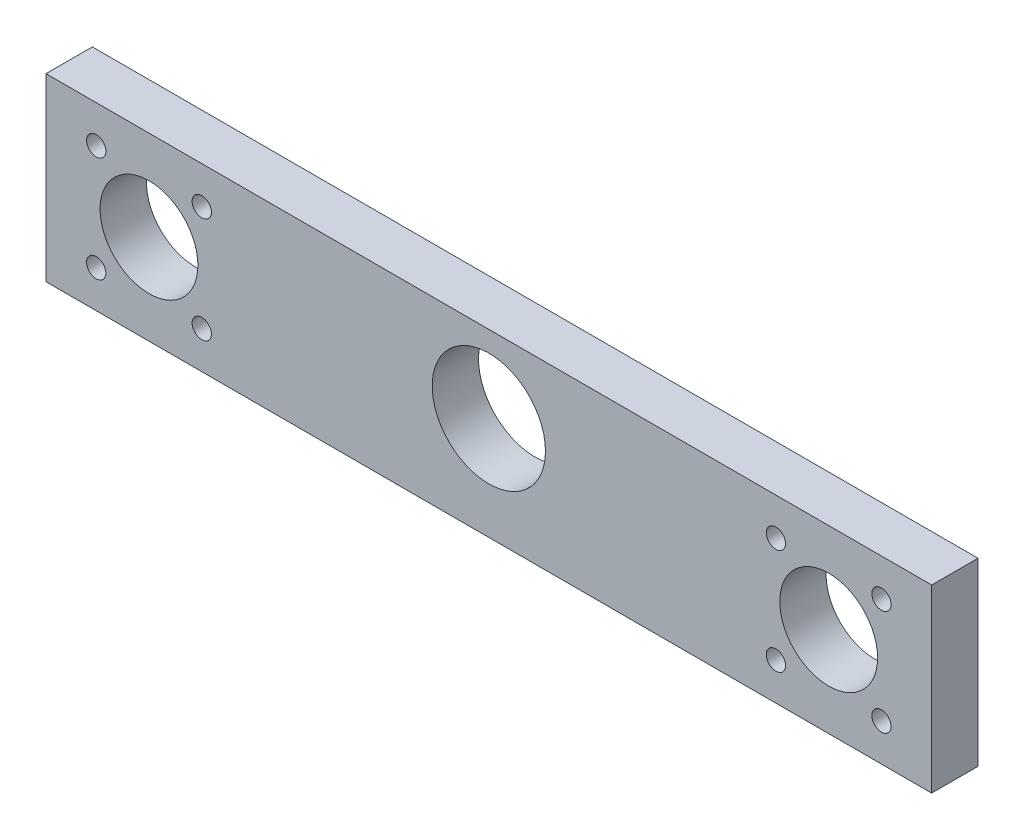
ISO-10303-21;
HEADER;
FILE_DESCRIPTION(('STEP AP214'),'2;1');
FILE_NAME('part.step','',(''),(''),'','','');
FILE_SCHEMA(('AUTOMOTIVE_DESIGN { 1 0 10303 214 1 1 1 1 }'));
ENDSEC;
DATA;
#1=APPLICATION_CONTEXT('core data for automotive mechanical design processes');
#2=APPLICATION_PROTOCOL_DEFINITION('international standard','automotive_design',2000,#1);
#3=PRODUCT_CONTEXT('',#1,'mechanical');
#4=PRODUCT('Part','Part','',(#3));
#5=PRODUCT_RELATED_PRODUCT_CATEGORY('part','',(#4));
#6=PRODUCT_DEFINITION_FORMATION('','',#4);
#7=PRODUCT_DEFINITION_CONTEXT('part definition',#1,'design');
#8=PRODUCT_DEFINITION('design','',#6,#7);
#9=PRODUCT_DEFINITION_SHAPE('','',#8);
#10=(LENGTH_UNIT() NAMED_UNIT(*) SI_UNIT(.MILLI.,.METRE.));
#11=(NAMED_UNIT(*) PLANE_ANGLE_UNIT() SI_UNIT($,.RADIAN.));
#12=(NAMED_UNIT(*) SI_UNIT($,.STERADIAN.) SOLID_ANGLE_UNIT());
#13=UNCERTAINTY_MEASURE_WITH_UNIT(LENGTH_MEASURE(1.E-05),#10,'distance_accuracy_value','');
#14=(GEOMETRIC_REPRESENTATION_CONTEXT(3) GLOBAL_UNCERTAINTY_ASSIGNED_CONTEXT((#13)) GLOBAL_UNIT_ASSIGNED_CONTEXT((#10,
#11,#12)) REPRESENTATION_CONTEXT('',''));
#15=CARTESIAN_POINT('',(0.,0.,0.));
#16=DIRECTION('',(0.,0.,1.));
#17=DIRECTION('',(1.,0.,0.));
#18=AXIS2_PLACEMENT_3D('',#15,#16,#17);
#19=CARTESIAN_POINT('',(0.,0.,9.));
#20=DIRECTION('',(1.,0.,0.));
#21=DIRECTION('',(0.,0.,-1.));
#22=AXIS2_PLACEMENT_3D('',#19,#20,#21);
#23=PLANE('',#22);
#24=DIRECTION('',(0.,-1.,0.));
#25=VECTOR('',#24,1.);
#26=CARTESIAN_POINT('',(0.,0.,0.));
#27=LINE('',#26,#25);
#28=CARTESIAN_POINT('',(0.,35.,0.));
#29=VERTEX_POINT('',#28);
#30=CARTESIAN_POINT('',(0.,0.,0.));
#31=VERTEX_POINT('',#30);
#32=EDGE_CURVE('E111',#29,#31,#27,.T.);
#33=ORIENTED_EDGE('',*,*,#32,.T.);
#34=DIRECTION('',(0.,0.,-1.));
#35=VECTOR('',#34,1.);
#36=CARTESIAN_POINT('',(0.,0.,9.));
#37=LINE('',#36,#35);
#38=CARTESIAN_POINT('',(0.,0.,9.));
#39=VERTEX_POINT('',#38);
#40=EDGE_CURVE('E11',#39,#31,#37,.T.);
#41=ORIENTED_EDGE('',*,*,#40,.F.);
#42=DIRECTION('',(0.,-1.,0.));
#43=VECTOR('',#42,1.);
#44=CARTESIAN_POINT('',(0.,0.,9.));
#45=LINE('',#44,#43);
#46=CARTESIAN_POINT('',(0.,35.,9.));
#47=VERTEX_POINT('',#46);
#48=EDGE_CURVE('E95',#47,#39,#45,.T.);
#49=ORIENTED_EDGE('',*,*,#48,.F.);
#50=DIRECTION('',(0.,0.,-1.));
#51=VECTOR('',#50,1.);
#52=CARTESIAN_POINT('',(0.,35.,9.));
#53=LINE('',#52,#51);
#54=EDGE_CURVE('E107',#47,#29,#53,.T.);
#55=ORIENTED_EDGE('',*,*,#54,.T.);
#56=EDGE_LOOP('',(#33,#41,#49,#55));
#57=FACE_BOUND('',#56,.T.);
#58=ADVANCED_FACE('F43',(#57),#23,.F.);
#59=CARTESIAN_POINT('',(0.,0.,9.));
#60=DIRECTION('',(0.,1.,0.));
#61=DIRECTION('',(0.,0.,1.));
#62=AXIS2_PLACEMENT_3D('',#59,#60,#61);
#63=PLANE('',#62);
#64=DIRECTION('',(1.,0.,0.));
#65=VECTOR('',#64,1.);
#66=CARTESIAN_POINT('',(0.,0.,0.));
#67=LINE('',#66,#65);
#68=CARTESIAN_POINT('',(172.,0.,0.));
#69=VERTEX_POINT('',#68);
#70=EDGE_CURVE('E100',#31,#69,#67,.T.);
#71=ORIENTED_EDGE('',*,*,#70,.T.);
#72=DIRECTION('',(0.,0.,-1.));
#73=VECTOR('',#72,1.);
#74=CARTESIAN_POINT('',(172.,0.,9.));
#75=LINE('',#74,#73);
#76=CARTESIAN_POINT('',(172.,0.,9.));
#77=VERTEX_POINT('',#76);
#78=EDGE_CURVE('E52',#77,#69,#75,.T.);
#79=ORIENTED_EDGE('',*,*,#78,.F.);
#80=DIRECTION('',(1.,0.,0.));
#81=VECTOR('',#80,1.);
#82=CARTESIAN_POINT('',(0.,0.,9.));
#83=LINE('',#82,#81);
#84=EDGE_CURVE('E90',#39,#77,#83,.T.);
#85=ORIENTED_EDGE('',*,*,#84,.F.);
#86=ORIENTED_EDGE('',*,*,#40,.T.);
#87=EDGE_LOOP('',(#71,#79,#85,#86));
#88=FACE_BOUND('',#87,.T.);
#89=ADVANCED_FACE('F99',(#88),#63,.F.);
#90=CARTESIAN_POINT('',(172.,0.,9.));
#91=DIRECTION('',(-1.,0.,0.));
#92=DIRECTION('',(0.,0.,1.));
#93=AXIS2_PLACEMENT_3D('',#90,#91,#92);
#94=PLANE('',#93);
#95=DIRECTION('',(0.,1.,0.));
#96=VECTOR('',#95,1.);
#97=CARTESIAN_POINT('',(172.,0.,0.));
#98=LINE('',#97,#96);
#99=CARTESIAN_POINT('',(172.,35.,0.));
#100=VERTEX_POINT('',#99);
#101=EDGE_CURVE('E77',#69,#100,#98,.T.);
#102=ORIENTED_EDGE('',*,*,#101,.T.);
#103=DIRECTION('',(0.,0.,-1.));
#104=VECTOR('',#103,1.);
#105=CARTESIAN_POINT('',(172.,35.,9.));
#106=LINE('',#105,#104);
#107=CARTESIAN_POINT('',(172.,35.,9.));
#108=VERTEX_POINT('',#107);
#109=EDGE_CURVE('E102',#108,#100,#106,.T.);
#110=ORIENTED_EDGE('',*,*,#109,.F.);
#111=DIRECTION('',(0.,1.,0.));
#112=VECTOR('',#111,1.);
#113=CARTESIAN_POINT('',(172.,0.,9.));
#114=LINE('',#113,#112);
#115=EDGE_CURVE('E93',#77,#108,#114,.T.);
#116=ORIENTED_EDGE('',*,*,#115,.F.);
#117=ORIENTED_EDGE('',*,*,#78,.T.);
#118=EDGE_LOOP('',(#102,#110,#116,#117));
#119=FACE_BOUND('',#118,.T.);
#120=ADVANCED_FACE('F103',(#119),#94,.F.);
#121=CARTESIAN_POINT('',(0.,35.,9.));
#122=DIRECTION('',(0.,-1.,0.));
#123=DIRECTION('',(0.,0.,-1.));
#124=AXIS2_PLACEMENT_3D('',#121,#122,#123);
#125=PLANE('',#124);
#126=DIRECTION('',(-1.,0.,0.));
#127=VECTOR('',#126,1.);
#128=CARTESIAN_POINT('',(0.,35.,0.));
#129=LINE('',#128,#127);
#130=EDGE_CURVE('E83',#100,#29,#129,.T.);
#131=ORIENTED_EDGE('',*,*,#130,.T.);
#132=ORIENTED_EDGE('',*,*,#54,.F.);
#133=DIRECTION('',(-1.,0.,0.));
#134=VECTOR('',#133,1.);
#135=CARTESIAN_POINT('',(0.,35.,9.));
#136=LINE('',#135,#134);
#137=EDGE_CURVE('E60',#108,#47,#136,.T.);
#138=ORIENTED_EDGE('',*,*,#137,.F.);
#139=ORIENTED_EDGE('',*,*,#109,.T.);
#140=EDGE_LOOP('',(#131,#132,#138,#139));
#141=FACE_BOUND('',#140,.T.);
#142=ADVANCED_FACE('F125',(#141),#125,.F.);
#143=CARTESIAN_POINT('',(0.,0.,9.));
#144=DIRECTION('',(0.,0.,-1.));
#145=DIRECTION('',(-1.,0.,0.));
#146=AXIS2_PLACEMENT_3D('',#143,#144,#145);
#147=PLANE('',#146);
#148=CARTESIAN_POINT('',(162.25,27.75,9.));
#149=DIRECTION('',(0.,0.,1.));
#150=DIRECTION('',(1.,0.,0.));
#151=AXIS2_PLACEMENT_3D('',#148,#149,#150);
#152=CIRCLE('',#151,1.87499999999999);
#153=CARTESIAN_POINT('',(164.125,27.75,9.));
#154=VERTEX_POINT('',#153);
#155=EDGE_CURVE('E161',#154,#154,#152,.T.);
#156=ORIENTED_EDGE('',*,*,#155,.F.);
#157=EDGE_LOOP('',(#156));
#158=FACE_BOUND('',#157,.T.);
#159=CARTESIAN_POINT('',(141.75,7.25,9.));
#160=DIRECTION('',(0.,0.,1.));
#161=DIRECTION('',(1.,0.,0.));
#162=AXIS2_PLACEMENT_3D('',#159,#160,#161);
#163=CIRCLE('',#162,1.87499999999999);
#164=CARTESIAN_POINT('',(143.625,7.25,9.));
#165=VERTEX_POINT('',#164);
#166=EDGE_CURVE('E176',#165,#165,#163,.T.);
#167=ORIENTED_EDGE('',*,*,#166,.F.);
#168=EDGE_LOOP('',(#167));
#169=FACE_BOUND('',#168,.T.);
#170=CARTESIAN_POINT('',(152.,17.5,9.));
#171=DIRECTION('',(0.,0.,1.));
#172=DIRECTION('',(1.,0.,0.));
#173=AXIS2_PLACEMENT_3D('',#170,#171,#172);
#174=CIRCLE('',#173,9.50000000000001);
#175=CARTESIAN_POINT('',(161.5,17.5,9.));
#176=VERTEX_POINT('',#175);
#177=EDGE_CURVE('E192',#176,#176,#174,.T.);
#178=ORIENTED_EDGE('',*,*,#177,.F.);
#179=EDGE_LOOP('',(#178));
#180=FACE_BOUND('',#179,.T.);
#181=CARTESIAN_POINT('',(162.25,7.25,9.));
#182=DIRECTION('',(0.,0.,1.));
#183=DIRECTION('',(1.,0.,0.));
#184=AXIS2_PLACEMENT_3D('',#181,#182,#183);
#185=CIRCLE('',#184,1.87499999999999);
#186=CARTESIAN_POINT('',(164.125,7.25,9.));
#187=VERTEX_POINT('',#186);
#188=EDGE_CURVE('E177',#187,#187,#185,.T.);
#189=ORIENTED_EDGE('',*,*,#188,.F.);
#190=EDGE_LOOP('',(#189));
#191=FACE_BOUND('',#190,.T.);
#192=CARTESIAN_POINT('',(30.25,27.75,9.));
#193=DIRECTION('',(0.,0.,1.));
#194=DIRECTION('',(1.,0.,0.));
#195=AXIS2_PLACEMENT_3D('',#192,#193,#194);
#196=CIRCLE('',#195,1.875);
#197=CARTESIAN_POINT('',(32.125,27.75,9.));
#198=VERTEX_POINT('',#197);
#199=EDGE_CURVE('E136',#198,#198,#196,.T.);
#200=ORIENTED_EDGE('',*,*,#199,.F.);
#201=EDGE_LOOP('',(#200));
#202=FACE_BOUND('',#201,.T.);
#203=CARTESIAN_POINT('',(9.75000000000001,7.25,9.));
#204=DIRECTION('',(0.,0.,1.));
#205=DIRECTION('',(1.,0.,0.));
#206=AXIS2_PLACEMENT_3D('',#203,#204,#205);
#207=CIRCLE('',#206,1.875);
#208=CARTESIAN_POINT('',(11.625,7.25,9.));
#209=VERTEX_POINT('',#208);
#210=EDGE_CURVE('E144',#209,#209,#207,.T.);
#211=ORIENTED_EDGE('',*,*,#210,.F.);
#212=EDGE_LOOP('',(#211));
#213=FACE_BOUND('',#212,.T.);
#214=CARTESIAN_POINT('',(30.25,7.25,9.));
#215=DIRECTION('',(0.,0.,1.));
#216=DIRECTION('',(1.,0.,0.));
#217=AXIS2_PLACEMENT_3D('',#214,#215,#216);
#218=CIRCLE('',#217,1.875);
#219=CARTESIAN_POINT('',(32.125,7.25,9.));
#220=VERTEX_POINT('',#219);
#221=EDGE_CURVE('E145',#220,#220,#218,.T.);
#222=ORIENTED_EDGE('',*,*,#221,.F.);
#223=EDGE_LOOP('',(#222));
#224=FACE_BOUND('',#223,.T.);
#225=CARTESIAN_POINT('',(141.75,27.75,9.));
#226=DIRECTION('',(0.,0.,1.));
#227=DIRECTION('',(1.,0.,0.));
#228=AXIS2_PLACEMENT_3D('',#225,#226,#227);
#229=CIRCLE('',#228,1.87499999999999);
#230=CARTESIAN_POINT('',(143.625,27.75,9.));
#231=VERTEX_POINT('',#230);
#232=EDGE_CURVE('E160',#231,#231,#229,.T.);
#233=ORIENTED_EDGE('',*,*,#232,.F.);
#234=EDGE_LOOP('',(#233));
#235=FACE_BOUND('',#234,.T.);
#236=CARTESIAN_POINT('',(20.,17.5,9.));
#237=DIRECTION('',(0.,0.,1.));
#238=DIRECTION('',(1.,0.,0.));
#239=AXIS2_PLACEMENT_3D('',#236,#237,#238);
#240=CIRCLE('',#239,9.5);
#241=CARTESIAN_POINT('',(29.5,17.5,9.));
#242=VERTEX_POINT('',#241);
#243=EDGE_CURVE('E200',#242,#242,#240,.T.);
#244=ORIENTED_EDGE('',*,*,#243,.F.);
#245=EDGE_LOOP('',(#244));
#246=FACE_BOUND('',#245,.T.);
#247=CARTESIAN_POINT('',(86.,20.,9.));
#248=DIRECTION('',(0.,0.,1.));
#249=DIRECTION('',(1.,0.,0.));
#250=AXIS2_PLACEMENT_3D('',#247,#248,#249);
#251=CIRCLE('',#250,11.);
#252=CARTESIAN_POINT('',(97.,20.,9.));
#253=VERTEX_POINT('',#252);
#254=EDGE_CURVE('E208',#253,#253,#251,.T.);
#255=ORIENTED_EDGE('',*,*,#254,.F.);
#256=EDGE_LOOP('',(#255));
#257=FACE_BOUND('',#256,.T.);
#258=CARTESIAN_POINT('',(9.75000000000001,27.75,9.));
#259=DIRECTION('',(0.,0.,1.));
#260=DIRECTION('',(1.,0.,0.));
#261=AXIS2_PLACEMENT_3D('',#258,#259,#260);
#262=CIRCLE('',#261,1.875);
#263=CARTESIAN_POINT('',(11.625,27.75,9.));
#264=VERTEX_POINT('',#263);
#265=EDGE_CURVE('E132',#264,#264,#262,.T.);
#266=ORIENTED_EDGE('',*,*,#265,.F.);
#267=EDGE_LOOP('',(#266));
#268=FACE_BOUND('',#267,.T.);
#269=ORIENTED_EDGE('',*,*,#48,.T.);
#270=ORIENTED_EDGE('',*,*,#84,.T.);
#271=ORIENTED_EDGE('',*,*,#115,.T.);
#272=ORIENTED_EDGE('',*,*,#137,.T.);
#273=EDGE_LOOP('',(#269,#270,#271,#272));
#274=FACE_BOUND('',#273,.T.);
#275=ADVANCED_FACE('F91',(#158,#169,#180,#191,#202,#213,#224,#235,#246,#257,#268,#274),#147,.F.);
#276=CARTESIAN_POINT('',(0.,0.,0.));
#277=DIRECTION('',(0.,0.,-1.));
#278=DIRECTION('',(-1.,0.,0.));
#279=AXIS2_PLACEMENT_3D('',#276,#277,#278);
#280=PLANE('',#279);
#281=CARTESIAN_POINT('',(162.25,27.75,0.));
#282=DIRECTION('',(0.,0.,1.));
#283=DIRECTION('',(1.,0.,0.));
#284=AXIS2_PLACEMENT_3D('',#281,#282,#283);
#285=CIRCLE('',#284,1.87499999999999);
#286=CARTESIAN_POINT('',(164.125,27.75,0.));
#287=VERTEX_POINT('',#286);
#288=EDGE_CURVE('E181',#287,#287,#285,.T.);
#289=ORIENTED_EDGE('',*,*,#288,.T.);
#290=EDGE_LOOP('',(#289));
#291=FACE_BOUND('',#290,.T.);
#292=CARTESIAN_POINT('',(141.75,7.25,0.));
#293=DIRECTION('',(0.,0.,1.));
#294=DIRECTION('',(1.,0.,0.));
#295=AXIS2_PLACEMENT_3D('',#292,#293,#294);
#296=CIRCLE('',#295,1.87499999999999);
#297=CARTESIAN_POINT('',(143.625,7.25,0.));
#298=VERTEX_POINT('',#297);
#299=EDGE_CURVE('E172',#298,#298,#296,.T.);
#300=ORIENTED_EDGE('',*,*,#299,.T.);
#301=EDGE_LOOP('',(#300));
#302=FACE_BOUND('',#301,.T.);
#303=CARTESIAN_POINT('',(152.,17.5,0.));
#304=DIRECTION('',(0.,0.,1.));
#305=DIRECTION('',(1.,0.,0.));
#306=AXIS2_PLACEMENT_3D('',#303,#304,#305);
#307=CIRCLE('',#306,9.50000000000001);
#308=CARTESIAN_POINT('',(161.5,17.5,0.));
#309=VERTEX_POINT('',#308);
#310=EDGE_CURVE('E196',#309,#309,#307,.T.);
#311=ORIENTED_EDGE('',*,*,#310,.T.);
#312=EDGE_LOOP('',(#311));
#313=FACE_BOUND('',#312,.T.);
#314=CARTESIAN_POINT('',(162.25,7.25,0.));
#315=DIRECTION('',(0.,0.,1.));
#316=DIRECTION('',(1.,0.,0.));
#317=AXIS2_PLACEMENT_3D('',#314,#315,#316);
#318=CIRCLE('',#317,1.87499999999999);
#319=CARTESIAN_POINT('',(164.125,7.25,0.));
#320=VERTEX_POINT('',#319);
#321=EDGE_CURVE('E188',#320,#320,#318,.T.);
#322=ORIENTED_EDGE('',*,*,#321,.T.);
#323=EDGE_LOOP('',(#322));
#324=FACE_BOUND('',#323,.T.);
#325=CARTESIAN_POINT('',(30.25,27.75,0.));
#326=DIRECTION('',(0.,0.,1.));
#327=DIRECTION('',(1.,0.,0.));
#328=AXIS2_PLACEMENT_3D('',#325,#326,#327);
#329=CIRCLE('',#328,1.875);
#330=CARTESIAN_POINT('',(32.125,27.75,0.));
#331=VERTEX_POINT('',#330);
#332=EDGE_CURVE('E149',#331,#331,#329,.T.);
#333=ORIENTED_EDGE('',*,*,#332,.T.);
#334=EDGE_LOOP('',(#333));
#335=FACE_BOUND('',#334,.T.);
#336=CARTESIAN_POINT('',(9.75000000000001,7.25,0.));
#337=DIRECTION('',(0.,0.,1.));
#338=DIRECTION('',(1.,0.,0.));
#339=AXIS2_PLACEMENT_3D('',#336,#337,#338);
#340=CIRCLE('',#339,1.875);
#341=CARTESIAN_POINT('',(11.625,7.25,0.));
#342=VERTEX_POINT('',#341);
#343=EDGE_CURVE('E140',#342,#342,#340,.T.);
#344=ORIENTED_EDGE('',*,*,#343,.T.);
#345=EDGE_LOOP('',(#344));
#346=FACE_BOUND('',#345,.T.);
#347=CARTESIAN_POINT('',(30.25,7.25,0.));
#348=DIRECTION('',(0.,0.,1.));
#349=DIRECTION('',(1.,0.,0.));
#350=AXIS2_PLACEMENT_3D('',#347,#348,#349);
#351=CIRCLE('',#350,1.875);
#352=CARTESIAN_POINT('',(32.125,7.25,0.));
#353=VERTEX_POINT('',#352);
#354=EDGE_CURVE('E165',#353,#353,#351,.T.);
#355=ORIENTED_EDGE('',*,*,#354,.T.);
#356=EDGE_LOOP('',(#355));
#357=FACE_BOUND('',#356,.T.);
#358=CARTESIAN_POINT('',(141.75,27.75,0.));
#359=DIRECTION('',(0.,0.,1.));
#360=DIRECTION('',(1.,0.,0.));
#361=AXIS2_PLACEMENT_3D('',#358,#359,#360);
#362=CIRCLE('',#361,1.87499999999999);
#363=CARTESIAN_POINT('',(143.625,27.75,0.));
#364=VERTEX_POINT('',#363);
#365=EDGE_CURVE('E156',#364,#364,#362,.T.);
#366=ORIENTED_EDGE('',*,*,#365,.T.);
#367=EDGE_LOOP('',(#366));
#368=FACE_BOUND('',#367,.T.);
#369=CARTESIAN_POINT('',(20.,17.5,0.));
#370=DIRECTION('',(0.,0.,1.));
#371=DIRECTION('',(1.,0.,0.));
#372=AXIS2_PLACEMENT_3D('',#369,#370,#371);
#373=CIRCLE('',#372,9.5);
#374=CARTESIAN_POINT('',(29.5,17.5,0.));
#375=VERTEX_POINT('',#374);
#376=EDGE_CURVE('E212',#375,#375,#373,.T.);
#377=ORIENTED_EDGE('',*,*,#376,.T.);
#378=EDGE_LOOP('',(#377));
#379=FACE_BOUND('',#378,.T.);
#380=CARTESIAN_POINT('',(86.,20.,0.));
#381=DIRECTION('',(0.,0.,1.));
#382=DIRECTION('',(1.,0.,0.));
#383=AXIS2_PLACEMENT_3D('',#380,#381,#382);
#384=CIRCLE('',#383,11.);
#385=CARTESIAN_POINT('',(97.,20.,0.));
#386=VERTEX_POINT('',#385);
#387=EDGE_CURVE('E204',#386,#386,#384,.T.);
#388=ORIENTED_EDGE('',*,*,#387,.T.);
#389=EDGE_LOOP('',(#388));
#390=FACE_BOUND('',#389,.T.);
#391=CARTESIAN_POINT('',(9.75000000000001,27.75,0.));
#392=DIRECTION('',(0.,0.,1.));
#393=DIRECTION('',(1.,0.,0.));
#394=AXIS2_PLACEMENT_3D('',#391,#392,#393);
#395=CIRCLE('',#394,1.875);
#396=CARTESIAN_POINT('',(11.625,27.75,0.));
#397=VERTEX_POINT('',#396);
#398=EDGE_CURVE('E115',#397,#397,#395,.T.);
#399=ORIENTED_EDGE('',*,*,#398,.T.);
#400=EDGE_LOOP('',(#399));
#401=FACE_BOUND('',#400,.T.);
#402=ORIENTED_EDGE('',*,*,#32,.F.);
#403=ORIENTED_EDGE('',*,*,#130,.F.);
#404=ORIENTED_EDGE('',*,*,#101,.F.);
#405=ORIENTED_EDGE('',*,*,#70,.F.);
#406=EDGE_LOOP('',(#402,#403,#404,#405));
#407=FACE_BOUND('',#406,.T.);
#408=ADVANCED_FACE('F128',(#291,#302,#313,#324,#335,#346,#357,#368,#379,#390,#401,#407),#280,.T.);
#409=CARTESIAN_POINT('',(9.75000000000001,27.75,0.));
#410=DIRECTION('',(0.,0.,1.));
#411=DIRECTION('',(1.,0.,0.));
#412=AXIS2_PLACEMENT_3D('',#409,#410,#411);
#413=CYLINDRICAL_SURFACE('',#412,1.875);
#414=ORIENTED_EDGE('',*,*,#398,.F.);
#415=EDGE_LOOP('',(#414));
#416=FACE_BOUND('',#415,.T.);
#417=ORIENTED_EDGE('',*,*,#265,.T.);
#418=EDGE_LOOP('',(#417));
#419=FACE_BOUND('',#418,.T.);
#420=ADVANCED_FACE('F230',(#416,#419),#413,.F.);
#421=CARTESIAN_POINT('',(86.,20.,0.));
#422=DIRECTION('',(0.,0.,1.));
#423=DIRECTION('',(1.,0.,0.));
#424=AXIS2_PLACEMENT_3D('',#421,#422,#423);
#425=CYLINDRICAL_SURFACE('',#424,11.);
#426=ORIENTED_EDGE('',*,*,#387,.F.);
#427=EDGE_LOOP('',(#426));
#428=FACE_BOUND('',#427,.T.);
#429=ORIENTED_EDGE('',*,*,#254,.T.);
#430=EDGE_LOOP('',(#429));
#431=FACE_BOUND('',#430,.T.);
#432=ADVANCED_FACE('F232',(#428,#431),#425,.F.);
#433=CARTESIAN_POINT('',(20.,17.5,0.));
#434=DIRECTION('',(0.,0.,1.));
#435=DIRECTION('',(1.,0.,0.));
#436=AXIS2_PLACEMENT_3D('',#433,#434,#435);
#437=CYLINDRICAL_SURFACE('',#436,9.5);
#438=ORIENTED_EDGE('',*,*,#376,.F.);
#439=EDGE_LOOP('',(#438));
#440=FACE_BOUND('',#439,.T.);
#441=ORIENTED_EDGE('',*,*,#243,.T.);
#442=EDGE_LOOP('',(#441));
#443=FACE_BOUND('',#442,.T.);
#444=ADVANCED_FACE('F220',(#440,#443),#437,.F.);
#445=CARTESIAN_POINT('',(141.75,27.75,0.));
#446=DIRECTION('',(0.,0.,1.));
#447=DIRECTION('',(1.,0.,0.));
#448=AXIS2_PLACEMENT_3D('',#445,#446,#447);
#449=CYLINDRICAL_SURFACE('',#448,1.87499999999999);
#450=ORIENTED_EDGE('',*,*,#365,.F.);
#451=EDGE_LOOP('',(#450));
#452=FACE_BOUND('',#451,.T.);
#453=ORIENTED_EDGE('',*,*,#232,.T.);
#454=EDGE_LOOP('',(#453));
#455=FACE_BOUND('',#454,.T.);
#456=ADVANCED_FACE('F289',(#452,#455),#449,.F.);
#457=CARTESIAN_POINT('',(30.25,7.25,0.));
#458=DIRECTION('',(0.,0.,1.));
#459=DIRECTION('',(1.,0.,0.));
#460=AXIS2_PLACEMENT_3D('',#457,#458,#459);
#461=CYLINDRICAL_SURFACE('',#460,1.875);
#462=ORIENTED_EDGE('',*,*,#354,.F.);
#463=EDGE_LOOP('',(#462));
#464=FACE_BOUND('',#463,.T.);
#465=ORIENTED_EDGE('',*,*,#221,.T.);
#466=EDGE_LOOP('',(#465));
#467=FACE_BOUND('',#466,.T.);
#468=ADVANCED_FACE('F300',(#464,#467),#461,.F.);
#469=CARTESIAN_POINT('',(9.75000000000001,7.25,0.));
#470=DIRECTION('',(0.,0.,1.));
#471=DIRECTION('',(1.,0.,0.));
#472=AXIS2_PLACEMENT_3D('',#469,#470,#471);
#473=CYLINDRICAL_SURFACE('',#472,1.875);
#474=ORIENTED_EDGE('',*,*,#343,.F.);
#475=EDGE_LOOP('',(#474));
#476=FACE_BOUND('',#475,.T.);
#477=ORIENTED_EDGE('',*,*,#210,.T.);
#478=EDGE_LOOP('',(#477));
#479=FACE_BOUND('',#478,.T.);
#480=ADVANCED_FACE('F311',(#476,#479),#473,.F.);
#481=CARTESIAN_POINT('',(30.25,27.75,0.));
#482=DIRECTION('',(0.,0.,1.));
#483=DIRECTION('',(1.,0.,0.));
#484=AXIS2_PLACEMENT_3D('',#481,#482,#483);
#485=CYLINDRICAL_SURFACE('',#484,1.875);
#486=ORIENTED_EDGE('',*,*,#332,.F.);
#487=EDGE_LOOP('',(#486));
#488=FACE_BOUND('',#487,.T.);
#489=ORIENTED_EDGE('',*,*,#199,.T.);
#490=EDGE_LOOP('',(#489));
#491=FACE_BOUND('',#490,.T.);
#492=ADVANCED_FACE('F322',(#488,#491),#485,.F.);
#493=CARTESIAN_POINT('',(162.25,7.25,0.));
#494=DIRECTION('',(0.,0.,1.));
#495=DIRECTION('',(1.,0.,0.));
#496=AXIS2_PLACEMENT_3D('',#493,#494,#495);
#497=CYLINDRICAL_SURFACE('',#496,1.87499999999999);
#498=ORIENTED_EDGE('',*,*,#321,.F.);
#499=EDGE_LOOP('',(#498));
#500=FACE_BOUND('',#499,.T.);
#501=ORIENTED_EDGE('',*,*,#188,.T.);
#502=EDGE_LOOP('',(#501));
#503=FACE_BOUND('',#502,.T.);
#504=ADVANCED_FACE('F332',(#500,#503),#497,.F.);
#505=CARTESIAN_POINT('',(152.,17.5,0.));
#506=DIRECTION('',(0.,0.,1.));
#507=DIRECTION('',(1.,0.,0.));
#508=AXIS2_PLACEMENT_3D('',#505,#506,#507);
#509=CYLINDRICAL_SURFACE('',#508,9.50000000000001);
#510=ORIENTED_EDGE('',*,*,#310,.F.);
#511=EDGE_LOOP('',(#510));
#512=FACE_BOUND('',#511,.T.);
#513=ORIENTED_EDGE('',*,*,#177,.T.);
#514=EDGE_LOOP('',(#513));
#515=FACE_BOUND('',#514,.T.);
#516=ADVANCED_FACE('F343',(#512,#515),#509,.F.);
#517=CARTESIAN_POINT('',(141.75,7.25,0.));
#518=DIRECTION('',(0.,0.,1.));
#519=DIRECTION('',(1.,0.,0.));
#520=AXIS2_PLACEMENT_3D('',#517,#518,#519);
#521=CYLINDRICAL_SURFACE('',#520,1.87499999999999);
#522=ORIENTED_EDGE('',*,*,#299,.F.);
#523=EDGE_LOOP('',(#522));
#524=FACE_BOUND('',#523,.T.);
#525=ORIENTED_EDGE('',*,*,#166,.T.);
#526=EDGE_LOOP('',(#525));
#527=FACE_BOUND('',#526,.T.);
#528=ADVANCED_FACE('F354',(#524,#527),#521,.F.);
#529=CARTESIAN_POINT('',(162.25,27.75,0.));
#530=DIRECTION('',(0.,0.,1.));
#531=DIRECTION('',(1.,0.,0.));
#532=AXIS2_PLACEMENT_3D('',#529,#530,#531);
#533=CYLINDRICAL_SURFACE('',#532,1.87499999999999);
#534=ORIENTED_EDGE('',*,*,#288,.F.);
#535=EDGE_LOOP('',(#534));
#536=FACE_BOUND('',#535,.T.);
#537=ORIENTED_EDGE('',*,*,#155,.T.);
#538=EDGE_LOOP('',(#537));
#539=FACE_BOUND('',#538,.T.);
#540=ADVANCED_FACE('F365',(#536,#539),#533,.F.);
#541=CLOSED_SHELL('',(#58,#89,#120,#142,#275,#408,#420,#432,#444,#456,#468,#480,#492,#504,#516,
#528,#540));
#542=MANIFOLD_SOLID_BREP('B2',#541);
#543=ADVANCED_BREP_SHAPE_REPRESENTATION('',(#18,#542),#14);
#544=SHAPE_DEFINITION_REPRESENTATION(#9,#543);
ENDSEC;
END-ISO-10303-21;
